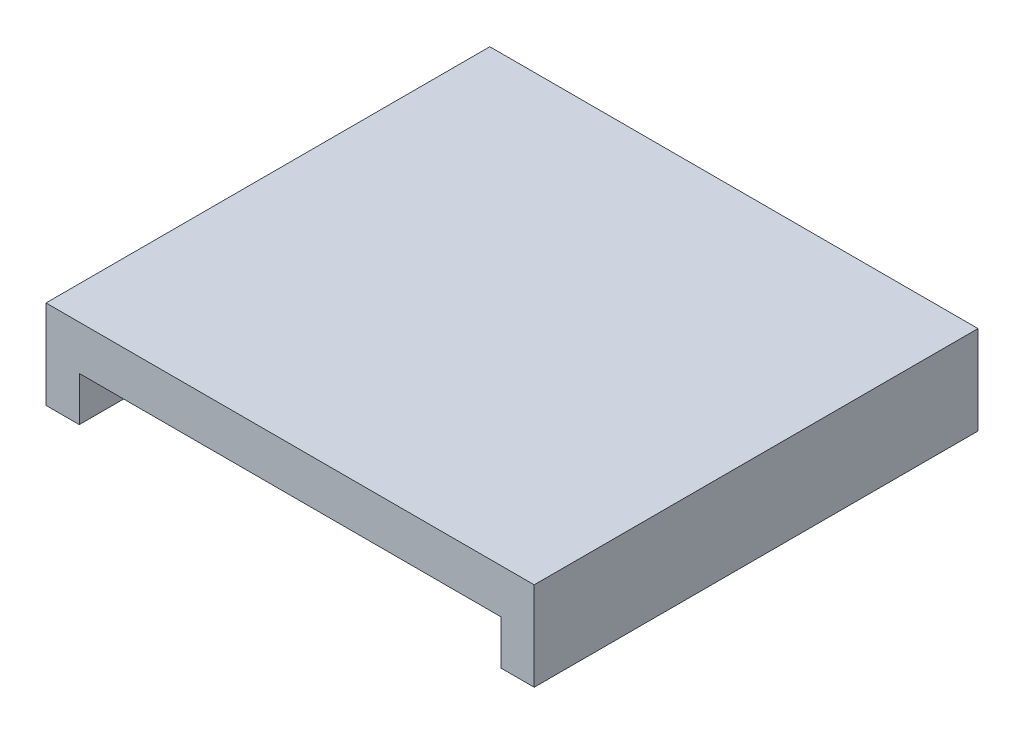
ISO-10303-21;
HEADER;
FILE_DESCRIPTION(('STEP AP214'),'2;1');
FILE_NAME('part.step','',(''),(''),'','','');
FILE_SCHEMA(('AUTOMOTIVE_DESIGN { 1 0 10303 214 1 1 1 1 }'));
ENDSEC;
DATA;
#1=APPLICATION_CONTEXT('core data for automotive mechanical design processes');
#2=APPLICATION_PROTOCOL_DEFINITION('international standard','automotive_design',2000,#1);
#3=PRODUCT_CONTEXT('',#1,'mechanical');
#4=PRODUCT('Part','Part','',(#3));
#5=PRODUCT_RELATED_PRODUCT_CATEGORY('part','',(#4));
#6=PRODUCT_DEFINITION_FORMATION('','',#4);
#7=PRODUCT_DEFINITION_CONTEXT('part definition',#1,'design');
#8=PRODUCT_DEFINITION('design','',#6,#7);
#9=PRODUCT_DEFINITION_SHAPE('','',#8);
#10=(LENGTH_UNIT() NAMED_UNIT(*) SI_UNIT(.MILLI.,.METRE.));
#11=(NAMED_UNIT(*) PLANE_ANGLE_UNIT() SI_UNIT($,.RADIAN.));
#12=(NAMED_UNIT(*) SI_UNIT($,.STERADIAN.) SOLID_ANGLE_UNIT());
#13=UNCERTAINTY_MEASURE_WITH_UNIT(LENGTH_MEASURE(1.E-05),#10,'distance_accuracy_value','');
#14=(GEOMETRIC_REPRESENTATION_CONTEXT(3) GLOBAL_UNCERTAINTY_ASSIGNED_CONTEXT((#13)) GLOBAL_UNIT_ASSIGNED_CONTEXT((#10,
#11,#12)) REPRESENTATION_CONTEXT('',''));
#15=CARTESIAN_POINT('',(0.,0.,0.));
#16=DIRECTION('',(0.,0.,1.));
#17=DIRECTION('',(1.,0.,0.));
#18=AXIS2_PLACEMENT_3D('',#15,#16,#17);
#19=CARTESIAN_POINT('',(0.,0.,0.));
#20=DIRECTION('',(0.,-1.,0.));
#21=DIRECTION('',(0.,0.,-1.));
#22=AXIS2_PLACEMENT_3D('',#19,#20,#21);
#23=PLANE('',#22);
#24=DIRECTION('',(-1.,0.,0.));
#25=VECTOR('',#24,1.);
#26=CARTESIAN_POINT('',(110.,0.,-100.));
#27=LINE('',#26,#25);
#28=CARTESIAN_POINT('',(95.,0.,-100.));
#29=VERTEX_POINT('',#28);
#30=CARTESIAN_POINT('',(-95.,0.,-100.));
#31=VERTEX_POINT('',#30);
#32=EDGE_CURVE('E53',#29,#31,#27,.T.);
#33=ORIENTED_EDGE('',*,*,#32,.F.);
#34=DIRECTION('',(0.,0.,-1.));
#35=VECTOR('',#34,1.);
#36=CARTESIAN_POINT('',(95.,0.,100.));
#37=LINE('',#36,#35);
#38=CARTESIAN_POINT('',(95.,0.,100.));
#39=VERTEX_POINT('',#38);
#40=EDGE_CURVE('E119',#39,#29,#37,.T.);
#41=ORIENTED_EDGE('',*,*,#40,.F.);
#42=DIRECTION('',(1.,0.,0.));
#43=VECTOR('',#42,1.);
#44=CARTESIAN_POINT('',(110.,0.,100.));
#45=LINE('',#44,#43);
#46=CARTESIAN_POINT('',(-95.,0.,100.));
#47=VERTEX_POINT('',#46);
#48=EDGE_CURVE('E146',#47,#39,#45,.T.);
#49=ORIENTED_EDGE('',*,*,#48,.F.);
#50=DIRECTION('',(0.,0.,1.));
#51=VECTOR('',#50,1.);
#52=CARTESIAN_POINT('',(-95.,0.,100.));
#53=LINE('',#52,#51);
#54=EDGE_CURVE('E127',#31,#47,#53,.T.);
#55=ORIENTED_EDGE('',*,*,#54,.F.);
#56=EDGE_LOOP('',(#33,#41,#49,#55));
#57=FACE_BOUND('',#56,.T.);
#58=ADVANCED_FACE('F33',(#57),#23,.T.);
#59=CARTESIAN_POINT('',(-110.,20.,-100.));
#60=DIRECTION('',(1.,0.,0.));
#61=DIRECTION('',(0.,0.,-1.));
#62=AXIS2_PLACEMENT_3D('',#59,#60,#61);
#63=PLANE('',#62);
#64=DIRECTION('',(0.,-1.,0.));
#65=VECTOR('',#64,1.);
#66=CARTESIAN_POINT('',(-110.,20.,-100.));
#67=LINE('',#66,#65);
#68=CARTESIAN_POINT('',(-110.,20.,-100.));
#69=VERTEX_POINT('',#68);
#70=CARTESIAN_POINT('',(-110.,-20.,-100.));
#71=VERTEX_POINT('',#70);
#72=EDGE_CURVE('E155',#69,#71,#67,.T.);
#73=ORIENTED_EDGE('',*,*,#72,.T.);
#74=DIRECTION('',(0.,0.,-1.));
#75=VECTOR('',#74,1.);
#76=CARTESIAN_POINT('',(-110.,-20.,100.));
#77=LINE('',#76,#75);
#78=CARTESIAN_POINT('',(-110.,-20.,100.));
#79=VERTEX_POINT('',#78);
#80=EDGE_CURVE('E128',#79,#71,#77,.T.);
#81=ORIENTED_EDGE('',*,*,#80,.F.);
#82=DIRECTION('',(0.,-1.,0.));
#83=VECTOR('',#82,1.);
#84=CARTESIAN_POINT('',(-110.,20.,100.));
#85=LINE('',#84,#83);
#86=CARTESIAN_POINT('',(-110.,20.,100.));
#87=VERTEX_POINT('',#86);
#88=EDGE_CURVE('E11',#87,#79,#85,.T.);
#89=ORIENTED_EDGE('',*,*,#88,.F.);
#90=DIRECTION('',(0.,0.,1.));
#91=VECTOR('',#90,1.);
#92=CARTESIAN_POINT('',(-110.,20.,-100.));
#93=LINE('',#92,#91);
#94=EDGE_CURVE('E147',#69,#87,#93,.T.);
#95=ORIENTED_EDGE('',*,*,#94,.F.);
#96=EDGE_LOOP('',(#73,#81,#89,#95));
#97=FACE_BOUND('',#96,.T.);
#98=ADVANCED_FACE('F35',(#97),#63,.F.);
#99=CARTESIAN_POINT('',(110.,20.,100.));
#100=DIRECTION('',(0.,0.,-1.));
#101=DIRECTION('',(-1.,0.,0.));
#102=AXIS2_PLACEMENT_3D('',#99,#100,#101);
#103=PLANE('',#102);
#104=ORIENTED_EDGE('',*,*,#88,.T.);
#105=DIRECTION('',(-1.,0.,0.));
#106=VECTOR('',#105,1.);
#107=CARTESIAN_POINT('',(-110.,-20.,100.));
#108=LINE('',#107,#106);
#109=CARTESIAN_POINT('',(-95.,-20.,100.));
#110=VERTEX_POINT('',#109);
#111=EDGE_CURVE('E135',#110,#79,#108,.T.);
#112=ORIENTED_EDGE('',*,*,#111,.F.);
#113=DIRECTION('',(0.,1.,0.));
#114=VECTOR('',#113,1.);
#115=CARTESIAN_POINT('',(-95.,-20.,100.));
#116=LINE('',#115,#114);
#117=EDGE_CURVE('E138',#110,#47,#116,.T.);
#118=ORIENTED_EDGE('',*,*,#117,.T.);
#119=ORIENTED_EDGE('',*,*,#48,.T.);
#120=DIRECTION('',(0.,1.,0.));
#121=VECTOR('',#120,1.);
#122=CARTESIAN_POINT('',(95.,-20.,100.));
#123=LINE('',#122,#121);
#124=CARTESIAN_POINT('',(95.,-20.,100.));
#125=VERTEX_POINT('',#124);
#126=EDGE_CURVE('E111',#125,#39,#123,.T.);
#127=ORIENTED_EDGE('',*,*,#126,.F.);
#128=DIRECTION('',(-1.,0.,0.));
#129=VECTOR('',#128,1.);
#130=CARTESIAN_POINT('',(110.,-20.,100.));
#131=LINE('',#130,#129);
#132=CARTESIAN_POINT('',(110.,-20.,100.));
#133=VERTEX_POINT('',#132);
#134=EDGE_CURVE('E108',#133,#125,#131,.T.);
#135=ORIENTED_EDGE('',*,*,#134,.F.);
#136=DIRECTION('',(0.,-1.,0.));
#137=VECTOR('',#136,1.);
#138=CARTESIAN_POINT('',(110.,20.,100.));
#139=LINE('',#138,#137);
#140=CARTESIAN_POINT('',(110.,20.,100.));
#141=VERTEX_POINT('',#140);
#142=EDGE_CURVE('E41',#141,#133,#139,.T.);
#143=ORIENTED_EDGE('',*,*,#142,.F.);
#144=DIRECTION('',(1.,0.,0.));
#145=VECTOR('',#144,1.);
#146=CARTESIAN_POINT('',(110.,20.,100.));
#147=LINE('',#146,#145);
#148=EDGE_CURVE('E150',#87,#141,#147,.T.);
#149=ORIENTED_EDGE('',*,*,#148,.F.);
#150=EDGE_LOOP('',(#104,#112,#118,#119,#127,#135,#143,#149));
#151=FACE_BOUND('',#150,.T.);
#152=ADVANCED_FACE('F109',(#151),#103,.F.);
#153=CARTESIAN_POINT('',(110.,20.,-100.));
#154=DIRECTION('',(-1.,0.,0.));
#155=DIRECTION('',(0.,0.,1.));
#156=AXIS2_PLACEMENT_3D('',#153,#154,#155);
#157=PLANE('',#156);
#158=ORIENTED_EDGE('',*,*,#142,.T.);
#159=DIRECTION('',(0.,0.,1.));
#160=VECTOR('',#159,1.);
#161=CARTESIAN_POINT('',(110.,-20.,100.));
#162=LINE('',#161,#160);
#163=CARTESIAN_POINT('',(110.,-20.,-100.));
#164=VERTEX_POINT('',#163);
#165=EDGE_CURVE('E103',#164,#133,#162,.T.);
#166=ORIENTED_EDGE('',*,*,#165,.F.);
#167=DIRECTION('',(0.,-1.,0.));
#168=VECTOR('',#167,1.);
#169=CARTESIAN_POINT('',(110.,20.,-100.));
#170=LINE('',#169,#168);
#171=CARTESIAN_POINT('',(110.,20.,-100.));
#172=VERTEX_POINT('',#171);
#173=EDGE_CURVE('E106',#172,#164,#170,.T.);
#174=ORIENTED_EDGE('',*,*,#173,.F.);
#175=DIRECTION('',(0.,0.,-1.));
#176=VECTOR('',#175,1.);
#177=CARTESIAN_POINT('',(110.,20.,-100.));
#178=LINE('',#177,#176);
#179=EDGE_CURVE('E104',#141,#172,#178,.T.);
#180=ORIENTED_EDGE('',*,*,#179,.F.);
#181=EDGE_LOOP('',(#158,#166,#174,#180));
#182=FACE_BOUND('',#181,.T.);
#183=ADVANCED_FACE('F100',(#182),#157,.F.);
#184=CARTESIAN_POINT('',(110.,20.,-100.));
#185=DIRECTION('',(0.,0.,1.));
#186=DIRECTION('',(1.,0.,0.));
#187=AXIS2_PLACEMENT_3D('',#184,#185,#186);
#188=PLANE('',#187);
#189=ORIENTED_EDGE('',*,*,#173,.T.);
#190=DIRECTION('',(1.,0.,0.));
#191=VECTOR('',#190,1.);
#192=CARTESIAN_POINT('',(110.,-20.,-100.));
#193=LINE('',#192,#191);
#194=CARTESIAN_POINT('',(95.,-20.,-100.));
#195=VERTEX_POINT('',#194);
#196=EDGE_CURVE('E118',#195,#164,#193,.T.);
#197=ORIENTED_EDGE('',*,*,#196,.F.);
#198=DIRECTION('',(0.,1.,0.));
#199=VECTOR('',#198,1.);
#200=CARTESIAN_POINT('',(95.,-20.,-100.));
#201=LINE('',#200,#199);
#202=EDGE_CURVE('E48',#195,#29,#201,.T.);
#203=ORIENTED_EDGE('',*,*,#202,.T.);
#204=ORIENTED_EDGE('',*,*,#32,.T.);
#205=DIRECTION('',(0.,1.,0.));
#206=VECTOR('',#205,1.);
#207=CARTESIAN_POINT('',(-95.,-20.,-100.));
#208=LINE('',#207,#206);
#209=CARTESIAN_POINT('',(-95.,-20.,-100.));
#210=VERTEX_POINT('',#209);
#211=EDGE_CURVE('E143',#210,#31,#208,.T.);
#212=ORIENTED_EDGE('',*,*,#211,.F.);
#213=DIRECTION('',(1.,0.,0.));
#214=VECTOR('',#213,1.);
#215=CARTESIAN_POINT('',(-110.,-20.,-100.));
#216=LINE('',#215,#214);
#217=EDGE_CURVE('E131',#71,#210,#216,.T.);
#218=ORIENTED_EDGE('',*,*,#217,.F.);
#219=ORIENTED_EDGE('',*,*,#72,.F.);
#220=DIRECTION('',(-1.,0.,0.));
#221=VECTOR('',#220,1.);
#222=CARTESIAN_POINT('',(110.,20.,-100.));
#223=LINE('',#222,#221);
#224=EDGE_CURVE('E153',#172,#69,#223,.T.);
#225=ORIENTED_EDGE('',*,*,#224,.F.);
#226=EDGE_LOOP('',(#189,#197,#203,#204,#212,#218,#219,#225));
#227=FACE_BOUND('',#226,.T.);
#228=ADVANCED_FACE('F160',(#227),#188,.F.);
#229=CARTESIAN_POINT('',(0.,20.,0.));
#230=DIRECTION('',(0.,-1.,0.));
#231=DIRECTION('',(0.,0.,-1.));
#232=AXIS2_PLACEMENT_3D('',#229,#230,#231);
#233=PLANE('',#232);
#234=ORIENTED_EDGE('',*,*,#94,.T.);
#235=ORIENTED_EDGE('',*,*,#148,.T.);
#236=ORIENTED_EDGE('',*,*,#179,.T.);
#237=ORIENTED_EDGE('',*,*,#224,.T.);
#238=EDGE_LOOP('',(#234,#235,#236,#237));
#239=FACE_BOUND('',#238,.T.);
#240=ADVANCED_FACE('F165',(#239),#233,.F.);
#241=CARTESIAN_POINT('',(-95.,-20.,100.));
#242=DIRECTION('',(-1.,0.,0.));
#243=DIRECTION('',(0.,0.,1.));
#244=AXIS2_PLACEMENT_3D('',#241,#242,#243);
#245=PLANE('',#244);
#246=ORIENTED_EDGE('',*,*,#54,.T.);
#247=ORIENTED_EDGE('',*,*,#117,.F.);
#248=DIRECTION('',(0.,0.,1.));
#249=VECTOR('',#248,1.);
#250=CARTESIAN_POINT('',(-95.,-20.,100.));
#251=LINE('',#250,#249);
#252=EDGE_CURVE('E133',#210,#110,#251,.T.);
#253=ORIENTED_EDGE('',*,*,#252,.F.);
#254=ORIENTED_EDGE('',*,*,#211,.T.);
#255=EDGE_LOOP('',(#246,#247,#253,#254));
#256=FACE_BOUND('',#255,.T.);
#257=ADVANCED_FACE('F175',(#256),#245,.F.);
#258=CARTESIAN_POINT('',(0.,-20.,0.));
#259=DIRECTION('',(0.,-1.,0.));
#260=DIRECTION('',(0.,0.,-1.));
#261=AXIS2_PLACEMENT_3D('',#258,#259,#260);
#262=PLANE('',#261);
#263=ORIENTED_EDGE('',*,*,#80,.T.);
#264=ORIENTED_EDGE('',*,*,#217,.T.);
#265=ORIENTED_EDGE('',*,*,#252,.T.);
#266=ORIENTED_EDGE('',*,*,#111,.T.);
#267=EDGE_LOOP('',(#263,#264,#265,#266));
#268=FACE_BOUND('',#267,.T.);
#269=ADVANCED_FACE('F171',(#268),#262,.T.);
#270=CARTESIAN_POINT('',(95.,-20.,100.));
#271=DIRECTION('',(1.,0.,0.));
#272=DIRECTION('',(0.,0.,-1.));
#273=AXIS2_PLACEMENT_3D('',#270,#271,#272);
#274=PLANE('',#273);
#275=ORIENTED_EDGE('',*,*,#40,.T.);
#276=ORIENTED_EDGE('',*,*,#202,.F.);
#277=DIRECTION('',(0.,0.,-1.));
#278=VECTOR('',#277,1.);
#279=CARTESIAN_POINT('',(95.,-20.,100.));
#280=LINE('',#279,#278);
#281=EDGE_CURVE('E114',#125,#195,#280,.T.);
#282=ORIENTED_EDGE('',*,*,#281,.F.);
#283=ORIENTED_EDGE('',*,*,#126,.T.);
#284=EDGE_LOOP('',(#275,#276,#282,#283));
#285=FACE_BOUND('',#284,.T.);
#286=ADVANCED_FACE('F179',(#285),#274,.F.);
#287=CARTESIAN_POINT('',(0.,-20.,0.));
#288=DIRECTION('',(0.,1.,0.));
#289=DIRECTION('',(0.,0.,1.));
#290=AXIS2_PLACEMENT_3D('',#287,#288,#289);
#291=PLANE('',#290);
#292=ORIENTED_EDGE('',*,*,#165,.T.);
#293=ORIENTED_EDGE('',*,*,#134,.T.);
#294=ORIENTED_EDGE('',*,*,#281,.T.);
#295=ORIENTED_EDGE('',*,*,#196,.T.);
#296=EDGE_LOOP('',(#292,#293,#294,#295));
#297=FACE_BOUND('',#296,.T.);
#298=ADVANCED_FACE('F117',(#297),#291,.F.);
#299=CLOSED_SHELL('',(#58,#98,#152,#183,#228,#240,#257,#269,#286,#298));
#300=MANIFOLD_SOLID_BREP('B2',#299);
#301=ADVANCED_BREP_SHAPE_REPRESENTATION('',(#18,#300),#14);
#302=SHAPE_DEFINITION_REPRESENTATION(#9,#301);
ENDSEC;
END-ISO-10303-21;
